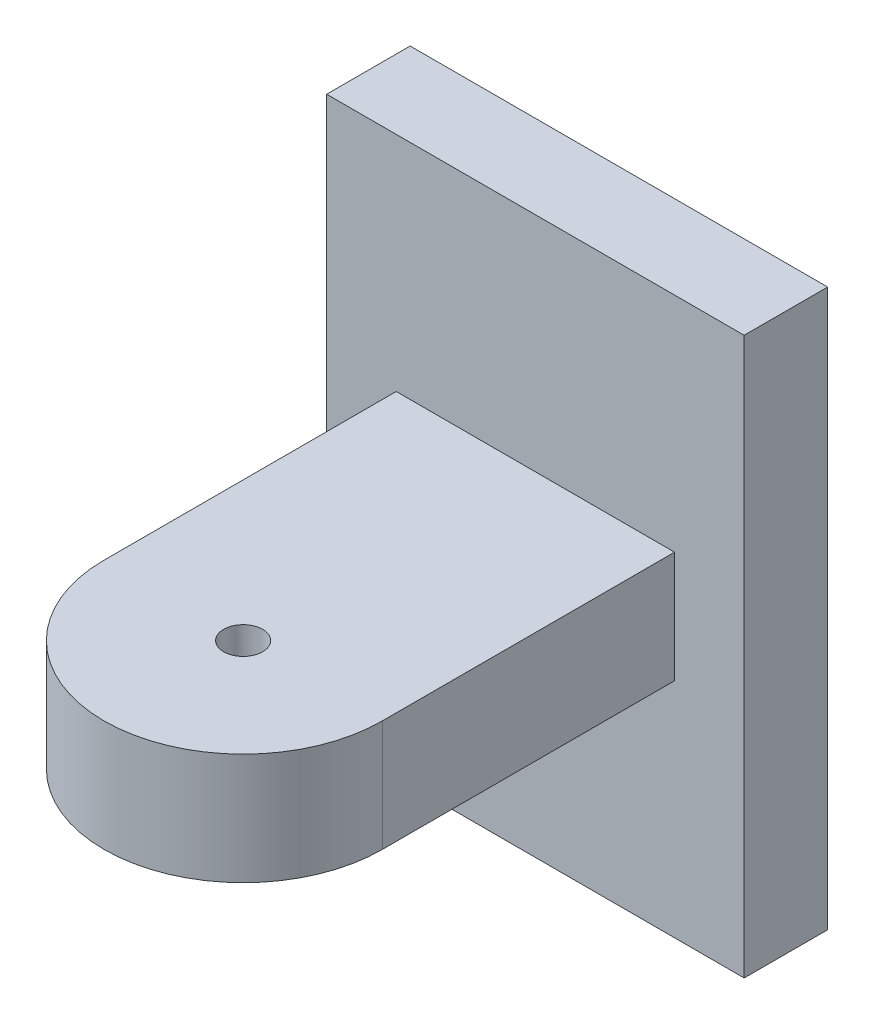
ISO-10303-21;
HEADER;
FILE_DESCRIPTION(('STEP AP214'),'2;1');
FILE_NAME('part.step','',(''),(''),'','','');
FILE_SCHEMA(('AUTOMOTIVE_DESIGN { 1 0 10303 214 1 1 1 1 }'));
ENDSEC;
DATA;
#1=APPLICATION_CONTEXT('core data for automotive mechanical design processes');
#2=APPLICATION_PROTOCOL_DEFINITION('international standard','automotive_design',2000,#1);
#3=PRODUCT_CONTEXT('',#1,'mechanical');
#4=PRODUCT('Part','Part','',(#3));
#5=PRODUCT_RELATED_PRODUCT_CATEGORY('part','',(#4));
#6=PRODUCT_DEFINITION_FORMATION('','',#4);
#7=PRODUCT_DEFINITION_CONTEXT('part definition',#1,'design');
#8=PRODUCT_DEFINITION('design','',#6,#7);
#9=PRODUCT_DEFINITION_SHAPE('','',#8);
#10=(LENGTH_UNIT() NAMED_UNIT(*) SI_UNIT(.MILLI.,.METRE.));
#11=(NAMED_UNIT(*) PLANE_ANGLE_UNIT() SI_UNIT($,.RADIAN.));
#12=(NAMED_UNIT(*) SI_UNIT($,.STERADIAN.) SOLID_ANGLE_UNIT());
#13=UNCERTAINTY_MEASURE_WITH_UNIT(LENGTH_MEASURE(1.E-05),#10,'distance_accuracy_value','');
#14=(GEOMETRIC_REPRESENTATION_CONTEXT(3) GLOBAL_UNCERTAINTY_ASSIGNED_CONTEXT((#13)) GLOBAL_UNIT_ASSIGNED_CONTEXT((#10,
#11,#12)) REPRESENTATION_CONTEXT('',''));
#15=CARTESIAN_POINT('',(0.,0.,0.));
#16=DIRECTION('',(0.,0.,1.));
#17=DIRECTION('',(1.,0.,0.));
#18=AXIS2_PLACEMENT_3D('',#15,#16,#17);
#19=CARTESIAN_POINT('',(5.,-4.,3.));
#20=DIRECTION('',(1.,0.,0.));
#21=DIRECTION('',(0.,0.,-1.));
#22=AXIS2_PLACEMENT_3D('',#19,#20,#21);
#23=PLANE('',#22);
#24=DIRECTION('',(0.,1.,0.));
#25=VECTOR('',#24,1.);
#26=CARTESIAN_POINT('',(5.,-4.,3.));
#27=LINE('',#26,#25);
#28=CARTESIAN_POINT('',(5.,-2.,3.));
#29=VERTEX_POINT('',#28);
#30=CARTESIAN_POINT('',(5.,2.,3.));
#31=VERTEX_POINT('',#30);
#32=EDGE_CURVE('E127',#29,#31,#27,.T.);
#33=ORIENTED_EDGE('',*,*,#32,.T.);
#34=DIRECTION('',(0.,0.,-1.));
#35=VECTOR('',#34,1.);
#36=CARTESIAN_POINT('',(5.,2.,3.));
#37=LINE('',#36,#35);
#38=CARTESIAN_POINT('',(5.,2.,13.5));
#39=VERTEX_POINT('',#38);
#40=EDGE_CURVE('E113',#39,#31,#37,.T.);
#41=ORIENTED_EDGE('',*,*,#40,.F.);
#42=DIRECTION('',(0.,1.,0.));
#43=VECTOR('',#42,1.);
#44=CARTESIAN_POINT('',(5.,-4.,13.5));
#45=LINE('',#44,#43);
#46=CARTESIAN_POINT('',(5.,-2.,13.4999999999966));
#47=VERTEX_POINT('',#46);
#48=EDGE_CURVE('E125',#47,#39,#45,.T.);
#49=ORIENTED_EDGE('',*,*,#48,.F.);
#50=DIRECTION('',(0.,0.,1.));
#51=VECTOR('',#50,1.);
#52=CARTESIAN_POINT('',(5.,-2.,13.4999999999966));
#53=LINE('',#52,#51);
#54=EDGE_CURVE('E213',#29,#47,#53,.T.);
#55=ORIENTED_EDGE('',*,*,#54,.F.);
#56=EDGE_LOOP('',(#33,#41,#49,#55));
#57=FACE_BOUND('',#56,.T.);
#58=ADVANCED_FACE('F34',(#57),#23,.T.);
#59=CARTESIAN_POINT('',(0.,-4.,13.5));
#60=DIRECTION('',(0.,1.,0.));
#61=DIRECTION('',(0.,0.,1.));
#62=AXIS2_PLACEMENT_3D('',#59,#60,#61);
#63=CYLINDRICAL_SURFACE('',#62,5.);
#64=ORIENTED_EDGE('',*,*,#48,.T.);
#65=CARTESIAN_POINT('',(-5.27355936696949E-13,2.,13.4999999999966));
#66=DIRECTION('',(0.,1.,0.));
#67=DIRECTION('',(0.,0.,1.));
#68=AXIS2_PLACEMENT_3D('',#65,#66,#67);
#69=CIRCLE('',#68,5.);
#70=CARTESIAN_POINT('',(-5.,2.,13.5));
#71=VERTEX_POINT('',#70);
#72=EDGE_CURVE('E109',#71,#39,#69,.T.);
#73=ORIENTED_EDGE('',*,*,#72,.F.);
#74=DIRECTION('',(0.,1.,0.));
#75=VECTOR('',#74,1.);
#76=CARTESIAN_POINT('',(-5.,-4.,13.5));
#77=LINE('',#76,#75);
#78=CARTESIAN_POINT('',(-5.,-2.,13.4999999999966));
#79=VERTEX_POINT('',#78);
#80=EDGE_CURVE('E133',#79,#71,#77,.T.);
#81=ORIENTED_EDGE('',*,*,#80,.F.);
#82=CARTESIAN_POINT('',(-5.27355936696949E-13,-2.,13.4999999999966));
#83=DIRECTION('',(0.,-1.,0.));
#84=DIRECTION('',(0.,0.,-1.));
#85=AXIS2_PLACEMENT_3D('',#82,#83,#84);
#86=CIRCLE('',#85,5.);
#87=EDGE_CURVE('E132',#47,#79,#86,.T.);
#88=ORIENTED_EDGE('',*,*,#87,.F.);
#89=EDGE_LOOP('',(#64,#73,#81,#88));
#90=FACE_BOUND('',#89,.T.);
#91=ADVANCED_FACE('F131',(#90),#63,.T.);
#92=CARTESIAN_POINT('',(-5.,-4.,3.));
#93=DIRECTION('',(-1.,0.,0.));
#94=DIRECTION('',(0.,0.,1.));
#95=AXIS2_PLACEMENT_3D('',#92,#93,#94);
#96=PLANE('',#95);
#97=ORIENTED_EDGE('',*,*,#80,.T.);
#98=DIRECTION('',(0.,0.,1.));
#99=VECTOR('',#98,1.);
#100=CARTESIAN_POINT('',(-5.,2.,13.5));
#101=LINE('',#100,#99);
#102=CARTESIAN_POINT('',(-5.,2.,3.));
#103=VERTEX_POINT('',#102);
#104=EDGE_CURVE('E116',#103,#71,#101,.T.);
#105=ORIENTED_EDGE('',*,*,#104,.F.);
#106=DIRECTION('',(0.,1.,0.));
#107=VECTOR('',#106,1.);
#108=CARTESIAN_POINT('',(-5.,-4.,3.));
#109=LINE('',#108,#107);
#110=CARTESIAN_POINT('',(-5.,-2.,3.));
#111=VERTEX_POINT('',#110);
#112=EDGE_CURVE('E137',#111,#103,#109,.T.);
#113=ORIENTED_EDGE('',*,*,#112,.F.);
#114=DIRECTION('',(0.,0.,-1.));
#115=VECTOR('',#114,1.);
#116=CARTESIAN_POINT('',(-5.,-2.,3.));
#117=LINE('',#116,#115);
#118=EDGE_CURVE('E210',#79,#111,#117,.T.);
#119=ORIENTED_EDGE('',*,*,#118,.F.);
#120=EDGE_LOOP('',(#97,#105,#113,#119));
#121=FACE_BOUND('',#120,.T.);
#122=ADVANCED_FACE('F183',(#121),#96,.T.);
#123=CARTESIAN_POINT('',(0.,-4.,13.5));
#124=DIRECTION('',(0.,1.,0.));
#125=DIRECTION('',(0.,0.,1.));
#126=AXIS2_PLACEMENT_3D('',#123,#124,#125);
#127=CYLINDRICAL_SURFACE('',#126,0.7);
#128=CARTESIAN_POINT('',(0.,-2.,13.5));
#129=DIRECTION('',(0.,-1.,0.));
#130=DIRECTION('',(0.,0.,-1.));
#131=AXIS2_PLACEMENT_3D('',#128,#129,#130);
#132=CIRCLE('',#131,0.7);
#133=CARTESIAN_POINT('',(0.,-2.,12.8));
#134=VERTEX_POINT('',#133);
#135=EDGE_CURVE('E143',#134,#134,#132,.F.);
#136=ORIENTED_EDGE('',*,*,#135,.F.);
#137=EDGE_LOOP('',(#136));
#138=FACE_BOUND('',#137,.T.);
#139=CARTESIAN_POINT('',(0.,2.,13.5));
#140=DIRECTION('',(0.,1.,0.));
#141=DIRECTION('',(0.,0.,1.));
#142=AXIS2_PLACEMENT_3D('',#139,#140,#141);
#143=CIRCLE('',#142,0.7);
#144=CARTESIAN_POINT('',(0.,2.,14.2));
#145=VERTEX_POINT('',#144);
#146=EDGE_CURVE('E204',#145,#145,#143,.F.);
#147=ORIENTED_EDGE('',*,*,#146,.F.);
#148=EDGE_LOOP('',(#147));
#149=FACE_BOUND('',#148,.T.);
#150=ADVANCED_FACE('F186',(#138,#149),#127,.F.);
#151=CARTESIAN_POINT('',(0.,0.,3.));
#152=DIRECTION('',(0.,0.,-1.));
#153=DIRECTION('',(-1.,0.,0.));
#154=AXIS2_PLACEMENT_3D('',#151,#152,#153);
#155=PLANE('',#154);
#156=ORIENTED_EDGE('',*,*,#32,.F.);
#157=DIRECTION('',(1.,0.,0.));
#158=VECTOR('',#157,1.);
#159=CARTESIAN_POINT('',(5.,-2.,3.));
#160=LINE('',#159,#158);
#161=EDGE_CURVE('E200',#111,#29,#160,.T.);
#162=ORIENTED_EDGE('',*,*,#161,.F.);
#163=ORIENTED_EDGE('',*,*,#112,.T.);
#164=DIRECTION('',(-1.,0.,0.));
#165=VECTOR('',#164,1.);
#166=CARTESIAN_POINT('',(-5.,2.,3.));
#167=LINE('',#166,#165);
#168=EDGE_CURVE('E128',#31,#103,#167,.T.);
#169=ORIENTED_EDGE('',*,*,#168,.F.);
#170=EDGE_LOOP('',(#156,#162,#163,#169));
#171=FACE_BOUND('',#170,.T.);
#172=DIRECTION('',(-1.,0.,0.));
#173=VECTOR('',#172,1.);
#174=CARTESIAN_POINT('',(7.5,10.,3.));
#175=LINE('',#174,#173);
#176=CARTESIAN_POINT('',(7.5,10.,3.));
#177=VERTEX_POINT('',#176);
#178=CARTESIAN_POINT('',(-7.5,10.,3.));
#179=VERTEX_POINT('',#178);
#180=EDGE_CURVE('E51',#177,#179,#175,.T.);
#181=ORIENTED_EDGE('',*,*,#180,.T.);
#182=DIRECTION('',(0.,-1.,0.));
#183=VECTOR('',#182,1.);
#184=CARTESIAN_POINT('',(-7.5,10.,3.));
#185=LINE('',#184,#183);
#186=CARTESIAN_POINT('',(-7.5,-10.,3.));
#187=VERTEX_POINT('',#186);
#188=EDGE_CURVE('E144',#179,#187,#185,.T.);
#189=ORIENTED_EDGE('',*,*,#188,.T.);
#190=DIRECTION('',(1.,0.,0.));
#191=VECTOR('',#190,1.);
#192=CARTESIAN_POINT('',(7.5,-10.,3.));
#193=LINE('',#192,#191);
#194=CARTESIAN_POINT('',(7.5,-10.,3.));
#195=VERTEX_POINT('',#194);
#196=EDGE_CURVE('E82',#187,#195,#193,.T.);
#197=ORIENTED_EDGE('',*,*,#196,.T.);
#198=DIRECTION('',(0.,1.,0.));
#199=VECTOR('',#198,1.);
#200=CARTESIAN_POINT('',(7.5,10.,3.));
#201=LINE('',#200,#199);
#202=EDGE_CURVE('E147',#195,#177,#201,.T.);
#203=ORIENTED_EDGE('',*,*,#202,.T.);
#204=EDGE_LOOP('',(#181,#189,#197,#203));
#205=FACE_BOUND('',#204,.T.);
#206=ADVANCED_FACE('F192',(#171,#205),#155,.F.);
#207=CARTESIAN_POINT('',(-7.5,10.,3.));
#208=DIRECTION('',(1.,0.,0.));
#209=DIRECTION('',(0.,1.,0.));
#210=AXIS2_PLACEMENT_3D('',#207,#208,#209);
#211=PLANE('',#210);
#212=DIRECTION('',(0.,-1.,0.));
#213=VECTOR('',#212,1.);
#214=CARTESIAN_POINT('',(-7.5,10.,0.));
#215=LINE('',#214,#213);
#216=CARTESIAN_POINT('',(-7.5,10.,0.));
#217=VERTEX_POINT('',#216);
#218=CARTESIAN_POINT('',(-7.5,-10.,0.));
#219=VERTEX_POINT('',#218);
#220=EDGE_CURVE('E135',#217,#219,#215,.T.);
#221=ORIENTED_EDGE('',*,*,#220,.T.);
#222=DIRECTION('',(0.,0.,-1.));
#223=VECTOR('',#222,1.);
#224=CARTESIAN_POINT('',(-7.5,-10.,3.));
#225=LINE('',#224,#223);
#226=EDGE_CURVE('E11',#187,#219,#225,.T.);
#227=ORIENTED_EDGE('',*,*,#226,.F.);
#228=ORIENTED_EDGE('',*,*,#188,.F.);
#229=DIRECTION('',(0.,0.,-1.));
#230=VECTOR('',#229,1.);
#231=CARTESIAN_POINT('',(-7.5,10.,3.));
#232=LINE('',#231,#230);
#233=EDGE_CURVE('E150',#179,#217,#232,.T.);
#234=ORIENTED_EDGE('',*,*,#233,.T.);
#235=EDGE_LOOP('',(#221,#227,#228,#234));
#236=FACE_BOUND('',#235,.T.);
#237=ADVANCED_FACE('F36',(#236),#211,.F.);
#238=CARTESIAN_POINT('',(7.5,-10.,3.));
#239=DIRECTION('',(0.,1.,0.));
#240=DIRECTION('',(0.,0.,1.));
#241=AXIS2_PLACEMENT_3D('',#238,#239,#240);
#242=PLANE('',#241);
#243=DIRECTION('',(1.,0.,0.));
#244=VECTOR('',#243,1.);
#245=CARTESIAN_POINT('',(7.5,-10.,0.));
#246=LINE('',#245,#244);
#247=CARTESIAN_POINT('',(7.5,-10.,0.));
#248=VERTEX_POINT('',#247);
#249=EDGE_CURVE('E153',#219,#248,#246,.T.);
#250=ORIENTED_EDGE('',*,*,#249,.T.);
#251=DIRECTION('',(0.,0.,-1.));
#252=VECTOR('',#251,1.);
#253=CARTESIAN_POINT('',(7.5,-10.,3.));
#254=LINE('',#253,#252);
#255=EDGE_CURVE('E43',#195,#248,#254,.T.);
#256=ORIENTED_EDGE('',*,*,#255,.F.);
#257=ORIENTED_EDGE('',*,*,#196,.F.);
#258=ORIENTED_EDGE('',*,*,#226,.T.);
#259=EDGE_LOOP('',(#250,#256,#257,#258));
#260=FACE_BOUND('',#259,.T.);
#261=ADVANCED_FACE('F176',(#260),#242,.F.);
#262=CARTESIAN_POINT('',(7.5,10.,3.));
#263=DIRECTION('',(-1.,0.,0.));
#264=DIRECTION('',(0.,-1.,0.));
#265=AXIS2_PLACEMENT_3D('',#262,#263,#264);
#266=PLANE('',#265);
#267=DIRECTION('',(0.,1.,0.));
#268=VECTOR('',#267,1.);
#269=CARTESIAN_POINT('',(7.5,10.,0.));
#270=LINE('',#269,#268);
#271=CARTESIAN_POINT('',(7.5,10.,0.));
#272=VERTEX_POINT('',#271);
#273=EDGE_CURVE('E69',#248,#272,#270,.T.);
#274=ORIENTED_EDGE('',*,*,#273,.T.);
#275=DIRECTION('',(0.,0.,-1.));
#276=VECTOR('',#275,1.);
#277=CARTESIAN_POINT('',(7.5,10.,3.));
#278=LINE('',#277,#276);
#279=EDGE_CURVE('E158',#177,#272,#278,.T.);
#280=ORIENTED_EDGE('',*,*,#279,.F.);
#281=ORIENTED_EDGE('',*,*,#202,.F.);
#282=ORIENTED_EDGE('',*,*,#255,.T.);
#283=EDGE_LOOP('',(#274,#280,#281,#282));
#284=FACE_BOUND('',#283,.T.);
#285=ADVANCED_FACE('F160',(#284),#266,.F.);
#286=CARTESIAN_POINT('',(7.5,10.,3.));
#287=DIRECTION('',(0.,-1.,0.));
#288=DIRECTION('',(0.,0.,-1.));
#289=AXIS2_PLACEMENT_3D('',#286,#287,#288);
#290=PLANE('',#289);
#291=ORIENTED_EDGE('',*,*,#233,.F.);
#292=ORIENTED_EDGE('',*,*,#180,.F.);
#293=ORIENTED_EDGE('',*,*,#279,.T.);
#294=DIRECTION('',(-1.,0.,0.));
#295=VECTOR('',#294,1.);
#296=CARTESIAN_POINT('',(7.5,10.,0.));
#297=LINE('',#296,#295);
#298=EDGE_CURVE('E75',#272,#217,#297,.T.);
#299=ORIENTED_EDGE('',*,*,#298,.T.);
#300=EDGE_LOOP('',(#291,#292,#293,#299));
#301=FACE_BOUND('',#300,.T.);
#302=ADVANCED_FACE('F167',(#301),#290,.F.);
#303=CARTESIAN_POINT('',(0.,0.,0.));
#304=DIRECTION('',(0.,0.,-1.));
#305=DIRECTION('',(-1.,0.,0.));
#306=AXIS2_PLACEMENT_3D('',#303,#304,#305);
#307=PLANE('',#306);
#308=ORIENTED_EDGE('',*,*,#220,.F.);
#309=ORIENTED_EDGE('',*,*,#298,.F.);
#310=ORIENTED_EDGE('',*,*,#273,.F.);
#311=ORIENTED_EDGE('',*,*,#249,.F.);
#312=EDGE_LOOP('',(#308,#309,#310,#311));
#313=FACE_BOUND('',#312,.T.);
#314=ADVANCED_FACE('F163',(#313),#307,.T.);
#315=CARTESIAN_POINT('',(-5.27355936696949E-13,-2.,13.4999999999966));
#316=DIRECTION('',(0.,-1.,0.));
#317=DIRECTION('',(0.,0.,-1.));
#318=AXIS2_PLACEMENT_3D('',#315,#316,#317);
#319=PLANE('',#318);
#320=ORIENTED_EDGE('',*,*,#87,.T.);
#321=ORIENTED_EDGE('',*,*,#118,.T.);
#322=ORIENTED_EDGE('',*,*,#161,.T.);
#323=ORIENTED_EDGE('',*,*,#54,.T.);
#324=EDGE_LOOP('',(#320,#321,#322,#323));
#325=FACE_BOUND('',#324,.T.);
#326=ORIENTED_EDGE('',*,*,#135,.T.);
#327=EDGE_LOOP('',(#326));
#328=FACE_BOUND('',#327,.T.);
#329=ADVANCED_FACE('F174',(#325,#328),#319,.T.);
#330=CARTESIAN_POINT('',(-5.27355936696949E-13,2.,13.4999999999966));
#331=DIRECTION('',(0.,1.,0.));
#332=DIRECTION('',(0.,0.,1.));
#333=AXIS2_PLACEMENT_3D('',#330,#331,#332);
#334=PLANE('',#333);
#335=ORIENTED_EDGE('',*,*,#72,.T.);
#336=ORIENTED_EDGE('',*,*,#40,.T.);
#337=ORIENTED_EDGE('',*,*,#168,.T.);
#338=ORIENTED_EDGE('',*,*,#104,.T.);
#339=EDGE_LOOP('',(#335,#336,#337,#338));
#340=FACE_BOUND('',#339,.T.);
#341=ORIENTED_EDGE('',*,*,#146,.T.);
#342=EDGE_LOOP('',(#341));
#343=FACE_BOUND('',#342,.T.);
#344=ADVANCED_FACE('F111',(#340,#343),#334,.T.);
#345=CLOSED_SHELL('',(#58,#91,#122,#150,#206,#237,#261,#285,#302,#314,#329,#344));
#346=MANIFOLD_SOLID_BREP('B2',#345);
#347=ADVANCED_BREP_SHAPE_REPRESENTATION('',(#18,#346),#14);
#348=SHAPE_DEFINITION_REPRESENTATION(#9,#347);
ENDSEC;
END-ISO-10303-21;
